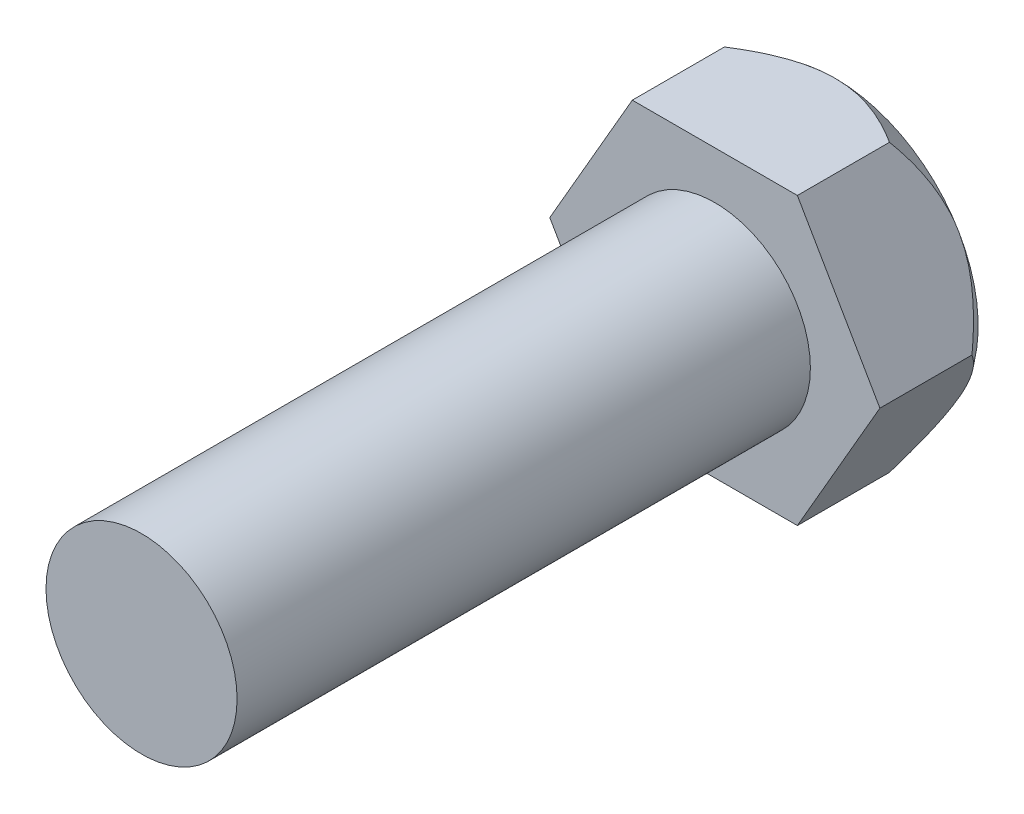
ISO-10303-21;
HEADER;
FILE_DESCRIPTION(('STEP AP214'),'2;1');
FILE_NAME('part.step','',(''),(''),'','','');
FILE_SCHEMA(('AUTOMOTIVE_DESIGN { 1 0 10303 214 1 1 1 1 }'));
ENDSEC;
DATA;
#1=APPLICATION_CONTEXT('core data for automotive mechanical design processes');
#2=APPLICATION_PROTOCOL_DEFINITION('international standard','automotive_design',2000,#1);
#3=PRODUCT_CONTEXT('',#1,'mechanical');
#4=PRODUCT('Part','Part','',(#3));
#5=PRODUCT_RELATED_PRODUCT_CATEGORY('part','',(#4));
#6=PRODUCT_DEFINITION_FORMATION('','',#4);
#7=PRODUCT_DEFINITION_CONTEXT('part definition',#1,'design');
#8=PRODUCT_DEFINITION('design','',#6,#7);
#9=PRODUCT_DEFINITION_SHAPE('','',#8);
#10=(LENGTH_UNIT() NAMED_UNIT(*) SI_UNIT(.MILLI.,.METRE.));
#11=(NAMED_UNIT(*) PLANE_ANGLE_UNIT() SI_UNIT($,.RADIAN.));
#12=(NAMED_UNIT(*) SI_UNIT($,.STERADIAN.) SOLID_ANGLE_UNIT());
#13=UNCERTAINTY_MEASURE_WITH_UNIT(LENGTH_MEASURE(1.E-05),#10,'distance_accuracy_value','');
#14=(GEOMETRIC_REPRESENTATION_CONTEXT(3) GLOBAL_UNCERTAINTY_ASSIGNED_CONTEXT((#13)) GLOBAL_UNIT_ASSIGNED_CONTEXT((#10,
#11,#12)) REPRESENTATION_CONTEXT('',''));
#15=CARTESIAN_POINT('',(0.,0.,0.));
#16=DIRECTION('',(0.,0.,1.));
#17=DIRECTION('',(1.,0.,0.));
#18=AXIS2_PLACEMENT_3D('',#15,#16,#17);
#19=CARTESIAN_POINT('',(5.48482755730155,-9.49999999999993,8.));
#20=DIRECTION('',(-0.866025403784441,0.499999999999995,0.));
#21=DIRECTION('',(-0.499999999999995,-0.866025403784442,0.));
#22=AXIS2_PLACEMENT_3D('',#19,#20,#21);
#23=PLANE('',#22);
#24=CARTESIAN_POINT('',(10.9697705846567,0.000199999999999862,1.88122056340848));
#25=CARTESIAN_POINT('',(10.8935354339522,-0.131843154342836,1.78365785441168));
#26=CARTESIAN_POINT('',(10.816606745852,-0.265087550692122,1.68822601810636));
#27=CARTESIAN_POINT('',(10.6612299080629,-0.534208128062211,1.50229007278218));
#28=CARTESIAN_POINT('',(10.582781090676,-0.670085465570009,1.41178819890072));
#29=CARTESIAN_POINT('',(10.4237842598011,-0.945476054887669,1.2358966425083));
#30=CARTESIAN_POINT('',(10.3432259068873,-1.08500721510855,1.1505440660845));
#31=CARTESIAN_POINT('',(10.1804593258293,-1.3669272032753,0.986485921294663));
#32=CARTESIAN_POINT('',(10.098251296768,-1.50931568639954,0.907779556763656));
#33=CARTESIAN_POINT('',(9.84749676483917,-1.94363527592842,0.681661259586502));
#34=CARTESIAN_POINT('',(9.67621858588584,-2.24029778410347,0.545834776093309));
#35=CARTESIAN_POINT('',(9.41458283133688,-2.69346420405888,0.372275627857531));
#36=CARTESIAN_POINT('',(9.32668397542142,-2.84570948843163,0.319494292936656));
#37=CARTESIAN_POINT('',(9.1494130983004,-3.15275165430755,0.225043414819986));
#38=CARTESIAN_POINT('',(9.06004143318878,-3.3075479190379,0.183371226336434));
#39=CARTESIAN_POINT('',(8.86036330662685,-3.65340057940335,0.104402159122605));
#40=CARTESIAN_POINT('',(8.74975883093453,-3.84497315084696,0.0700625500885323));
#41=CARTESIAN_POINT('',(8.52744089162739,-4.23003911716095,0.0209613729343854));
#42=CARTESIAN_POINT('',(8.41572726041598,-4.42353280231713,0.00620281036134691));
#43=CARTESIAN_POINT('',(8.19288840388419,-4.80950102373074,-0.00300231555809607));
#44=CARTESIAN_POINT('',(8.0817646947536,-5.00197293387044,0.00240640186772825));
#45=CARTESIAN_POINT('',(7.86021016246619,-5.3857166404394,0.0329568256302981));
#46=CARTESIAN_POINT('',(7.74977932207939,-5.57698846671185,0.0580980392911018));
#47=CARTESIAN_POINT('',(7.53097175600113,-5.9559742882399,0.12681013787851));
#48=CARTESIAN_POINT('',(7.42258726614342,-6.14370173142589,0.170283074784708));
#49=CARTESIAN_POINT('',(7.20786067292125,-6.51561910062287,0.273922888742278));
#50=CARTESIAN_POINT('',(7.1015187439428,-6.69980872458842,0.334091184465168));
#51=CARTESIAN_POINT('',(6.78484297986646,-7.24830723749434,0.537447701429925));
#52=CARTESIAN_POINT('',(6.57805171204337,-7.60648021992552,0.703075333685772));
#53=CARTESIAN_POINT('',(6.29899379765979,-8.0898227058921,0.962396805127114));
#54=CARTESIAN_POINT('',(6.22217740709821,-8.22287259719881,1.0377192160485));
#55=CARTESIAN_POINT('',(6.06999139464803,-8.48646650296383,1.19406371213756));
#56=CARTESIAN_POINT('',(5.9946217229499,-8.61701060369478,1.27508560062651));
#57=CARTESIAN_POINT('',(5.84608588643526,-8.8742822192829,1.44121704219265));
#58=CARTESIAN_POINT('',(5.77290477373322,-9.00103562463725,1.5262735866253));
#59=CARTESIAN_POINT('',(5.62785173312317,-9.2522748607662,1.70067193385964));
#60=CARTESIAN_POINT('',(5.55597950701029,-9.37676120804679,1.79001274328518));
#61=CARTESIAN_POINT('',(5.48471208724771,-9.50019999999993,1.88122056340848));
#62=B_SPLINE_CURVE_WITH_KNOTS('',3,(#24,#25,#26,#27,#28,#29,#30,#31,#32,#33,#34,#35,#36,#37,#38,
#39,#40,#41,#42,#43,#44,#45,#46,#47,#48,#49,#50,#51,#52,#53,#54,#55,#56,#57,#58,#59,#60,#61),
.UNSPECIFIED.,.F.,.F.,(4,2,2,2,2,2,2,2,2,2,2,2,2,2,2,2,2,2,4),(0.,0.543048266611905,
1.08634072461626,1.63316917381195,2.17993202397011,3.28307493249778,3.8334344366525,
4.38366277300713,5.0544017416688,5.72524365193724,6.39128093508673,7.0573015893159,
7.71980784690556,8.38237041755489,9.71468864790707,10.2279729814083,10.7412396110703,
11.249014778236,11.7566727734745),.UNSPECIFIED.);
#63=CARTESIAN_POINT('',(10.9696551146029,0.,1.88107276614572));
#64=VERTEX_POINT('',#63);
#65=CARTESIAN_POINT('',(8.22724133595219,-4.74999999999995,0.));
#66=VERTEX_POINT('',#65);
#67=EDGE_CURVE('E122',#64,#66,#62,.T.);
#68=ORIENTED_EDGE('',*,*,#67,.F.);
#69=DIRECTION('',(0.,0.,-1.));
#70=VECTOR('',#69,1.);
#71=CARTESIAN_POINT('',(10.9696551146029,0.,8.));
#72=LINE('',#71,#70);
#73=CARTESIAN_POINT('',(10.9696551146029,0.,8.));
#74=VERTEX_POINT('',#73);
#75=EDGE_CURVE('E126',#74,#64,#72,.T.);
#76=ORIENTED_EDGE('',*,*,#75,.F.);
#77=DIRECTION('',(0.499999999999995,0.866025403784441,0.));
#78=VECTOR('',#77,1.);
#79=CARTESIAN_POINT('',(5.48482755730155,-9.49999999999993,8.));
#80=LINE('',#79,#78);
#81=CARTESIAN_POINT('',(5.48482755730155,-9.49999999999993,8.));
#82=VERTEX_POINT('',#81);
#83=EDGE_CURVE('E221',#82,#74,#80,.T.);
#84=ORIENTED_EDGE('',*,*,#83,.F.);
#85=DIRECTION('',(0.,0.,-1.));
#86=VECTOR('',#85,1.);
#87=CARTESIAN_POINT('',(5.48482755730155,-9.49999999999993,8.));
#88=LINE('',#87,#86);
#89=CARTESIAN_POINT('',(5.48482755730155,-9.49999999999993,1.88107276614572));
#90=VERTEX_POINT('',#89);
#91=EDGE_CURVE('E209',#82,#90,#88,.T.);
#92=ORIENTED_EDGE('',*,*,#91,.T.);
#93=EDGE_CURVE('E177',#66,#90,#62,.T.);
#94=ORIENTED_EDGE('',*,*,#93,.F.);
#95=EDGE_LOOP('',(#68,#76,#84,#92,#94));
#96=FACE_BOUND('',#95,.T.);
#97=ADVANCED_FACE('F32',(#96),#23,.F.);
#98=CARTESIAN_POINT('',(10.9696551146029,0.,8.));
#99=DIRECTION('',(-0.866025403784438,-0.500000000000001,0.));
#100=DIRECTION('',(0.500000000000001,-0.866025403784438,0.));
#101=AXIS2_PLACEMENT_3D('',#98,#99,#100);
#102=PLANE('',#101);
#103=CARTESIAN_POINT('',(5.48471208724758,9.5002,1.88122056340848));
#104=CARTESIAN_POINT('',(5.56094723795206,9.36815684565716,1.78365785441167));
#105=CARTESIAN_POINT('',(5.63787592605233,9.23491244930788,1.68822601810635));
#106=CARTESIAN_POINT('',(5.79325276384142,8.96579187193779,1.50229007278217));
#107=CARTESIAN_POINT('',(5.87170158122832,8.82991453442999,1.41178819890071));
#108=CARTESIAN_POINT('',(6.03069841210316,8.55452394511232,1.23589664250828));
#109=CARTESIAN_POINT('',(6.11125676501703,8.41499278489145,1.15054406608448));
#110=CARTESIAN_POINT('',(6.27402334607504,8.13307279672469,0.986485921294641));
#111=CARTESIAN_POINT('',(6.35623137513633,7.99068431360045,0.907779556763632));
#112=CARTESIAN_POINT('',(6.60698590706516,7.55636472407156,0.681661259586471));
#113=CARTESIAN_POINT('',(6.77826408601849,7.25970221589651,0.545834776093274));
#114=CARTESIAN_POINT('',(7.03989984056745,6.80653579594109,0.37227562785749));
#115=CARTESIAN_POINT('',(7.12779869648291,6.65429051156834,0.319494292936613));
#116=CARTESIAN_POINT('',(7.30506957360394,6.34724834569243,0.225043414819941));
#117=CARTESIAN_POINT('',(7.39444123871556,6.19245208096207,0.183371226336388));
#118=CARTESIAN_POINT('',(7.5941193652775,5.84659942059662,0.104402159122558));
#119=CARTESIAN_POINT('',(7.70472384096982,5.65502684915301,0.0700625500884833));
#120=CARTESIAN_POINT('',(7.92704178027696,5.26996088283903,0.0209613729343354));
#121=CARTESIAN_POINT('',(8.03875541148837,5.07646719768285,0.00620281036129769));
#122=CARTESIAN_POINT('',(8.26159426802016,4.69049897626924,-0.00300231555814454));
#123=CARTESIAN_POINT('',(8.37271797715076,4.49802706612954,0.00240640186767974));
#124=CARTESIAN_POINT('',(8.59427250943817,4.11428335956059,0.0329568256302478));
#125=CARTESIAN_POINT('',(8.70470334982496,3.92301153328813,0.0580980392910498));
#126=CARTESIAN_POINT('',(8.92351091590323,3.54402571176009,0.126810137878457));
#127=CARTESIAN_POINT('',(9.03189540576094,3.3562982685741,0.170283074784657));
#128=CARTESIAN_POINT('',(9.24662199898311,2.98438089937712,0.273922888742226));
#129=CARTESIAN_POINT('',(9.35296392796156,2.80019127541157,0.334091184465116));
#130=CARTESIAN_POINT('',(9.6696396920379,2.25169276250566,0.537447701429871));
#131=CARTESIAN_POINT('',(9.876430959861,1.89351978007447,0.703075333685717));
#132=CARTESIAN_POINT('',(10.1554888742446,1.4101772941079,0.962396805127061));
#133=CARTESIAN_POINT('',(10.2323052648062,1.27712740280117,1.03771921604845));
#134=CARTESIAN_POINT('',(10.3844912772564,1.01353349703614,1.19406371213752));
#135=CARTESIAN_POINT('',(10.4598609489545,0.882989396305185,1.27508560062648));
#136=CARTESIAN_POINT('',(10.6083967854691,0.625717780717059,1.44121704219262));
#137=CARTESIAN_POINT('',(10.6815778981712,0.498964375362699,1.52627358662528));
#138=CARTESIAN_POINT('',(10.8266309387812,0.247725139233735,1.70067193385963));
#139=CARTESIAN_POINT('',(10.8985031648941,0.123238791953139,1.79001274328518));
#140=CARTESIAN_POINT('',(10.9697705846567,-0.000200000000000309,1.88122056340848));
#141=B_SPLINE_CURVE_WITH_KNOTS('',3,(#103,#104,#105,#106,#107,#108,#109,#110,#111,#112,#113,
#114,#115,#116,#117,#118,#119,#120,#121,#122,#123,#124,#125,#126,#127,#128,#129,#130,#131,#132,
#133,#134,#135,#136,#137,#138,#139,#140),.UNSPECIFIED.,.F.,.F.,(4,2,2,2,2,2,2,2,2,2,2,2,2,2,2,2,
2,2,4),(0.,0.543048266611915,1.08634072461628,1.63316917381198,2.17993202397015,
3.28307493249783,3.83343443665256,4.3836627730072,5.05440174166887,5.72524365193731,
6.3912809350868,7.05730158931596,7.71980784690562,8.38237041755495,9.71468864790712,
10.2279729814084,10.7412396110705,11.2490147782361,11.7566727734747),.UNSPECIFIED.);
#142=CARTESIAN_POINT('',(5.48482755730142,9.5,1.88107276614572));
#143=VERTEX_POINT('',#142);
#144=CARTESIAN_POINT('',(8.22724133595215,4.75000000000001,0.));
#145=VERTEX_POINT('',#144);
#146=EDGE_CURVE('E103',#143,#145,#141,.T.);
#147=ORIENTED_EDGE('',*,*,#146,.F.);
#148=DIRECTION('',(0.,0.,-1.));
#149=VECTOR('',#148,1.);
#150=CARTESIAN_POINT('',(5.48482755730142,9.5,8.));
#151=LINE('',#150,#149);
#152=CARTESIAN_POINT('',(5.48482755730142,9.5,8.));
#153=VERTEX_POINT('',#152);
#154=EDGE_CURVE('E206',#153,#143,#151,.T.);
#155=ORIENTED_EDGE('',*,*,#154,.F.);
#156=DIRECTION('',(-0.500000000000001,0.866025403784438,0.));
#157=VECTOR('',#156,1.);
#158=CARTESIAN_POINT('',(10.9696551146029,0.,8.));
#159=LINE('',#158,#157);
#160=EDGE_CURVE('E218',#74,#153,#159,.T.);
#161=ORIENTED_EDGE('',*,*,#160,.F.);
#162=ORIENTED_EDGE('',*,*,#75,.T.);
#163=EDGE_CURVE('E115',#145,#64,#141,.T.);
#164=ORIENTED_EDGE('',*,*,#163,.F.);
#165=EDGE_LOOP('',(#147,#155,#161,#162,#164));
#166=FACE_BOUND('',#165,.T.);
#167=ADVANCED_FACE('F131',(#166),#102,.F.);
#168=CARTESIAN_POINT('',(5.48482755730142,9.5,8.));
#169=DIRECTION('',(0.,-1.,0.));
#170=DIRECTION('',(1.,0.,0.));
#171=AXIS2_PLACEMENT_3D('',#168,#169,#170);
#172=PLANE('',#171);
#173=CARTESIAN_POINT('',(-11.1730063148762,9.49999999999994,6.61193908622565));
#174=CARTESIAN_POINT('',(-10.9210228263725,9.49999999999994,6.36628117361341));
#175=CARTESIAN_POINT('',(-10.6673352499112,9.49999999999994,6.12234504515453));
#176=CARTESIAN_POINT('',(-10.1558458750238,9.49999999999995,5.63870149425191));
#177=CARTESIAN_POINT('',(-9.89804307460484,9.49999999999995,5.39899513255183));
#178=CARTESIAN_POINT('',(-9.37544105634884,9.49999999999995,4.92262191610688));
#179=CARTESIAN_POINT('',(-9.11060013242283,9.49999999999995,4.68600067428334));
#180=CARTESIAN_POINT('',(-8.57532573823089,9.49999999999995,4.21919736473347));
#181=CARTESIAN_POINT('',(-8.30489272212796,9.49999999999995,3.98901477763493));
#182=CARTESIAN_POINT('',(-7.73922593939858,9.49999999999996,3.52158290010933));
#183=CARTESIAN_POINT('',(-7.44353827109927,9.49999999999996,3.28488038720294));
#184=CARTESIAN_POINT('',(-6.84312021189026,9.49999999999996,2.8230179501509));
#185=CARTESIAN_POINT('',(-6.5383878700482,9.49999999999996,2.59786054527033));
#186=CARTESIAN_POINT('',(-5.91938593754483,9.49999999999996,2.16345831894875));
#187=CARTESIAN_POINT('',(-5.6051552876495,9.49999999999996,1.95415833132407));
#188=CARTESIAN_POINT('',(-4.96435446808387,9.49999999999996,1.55544081216342));
#189=CARTESIAN_POINT('',(-4.63779157079238,9.49999999999996,1.36601180413869));
#190=CARTESIAN_POINT('',(-4.18283699307235,9.49999999999997,1.125703876405));
#191=CARTESIAN_POINT('',(-4.06048205926938,9.49999999999997,1.06332106829326));
#192=CARTESIAN_POINT('',(-3.81386904901428,9.49999999999997,0.942469332665061));
#193=CARTESIAN_POINT('',(-3.68961125917642,9.49999999999997,0.883999822703412));
#194=CARTESIAN_POINT('',(-3.43912547154442,9.49999999999997,0.771375889658834));
#195=CARTESIAN_POINT('',(-3.31289717823721,9.49999999999997,0.717222121381308));
#196=CARTESIAN_POINT('',(-3.05844394687724,9.49999999999997,0.613674079406628));
#197=CARTESIAN_POINT('',(-2.93021814685785,9.49999999999997,0.564281930469366));
#198=CARTESIAN_POINT('',(-2.54578064776804,9.49999999999997,0.425127556355024));
#199=CARTESIAN_POINT('',(-2.28673679440347,9.49999999999997,0.342985163816335));
#200=CARTESIAN_POINT('',(-1.76220499574268,9.49999999999998,0.203075554443009));
#201=CARTESIAN_POINT('',(-1.49672069243637,9.49999999999998,0.145294886181791));
#202=CARTESIAN_POINT('',(-1.0122956378565,9.49999999999998,0.0657414901185175));
#203=CARTESIAN_POINT('',(-0.794137673399279,9.49999999999998,0.0392023304317399));
#204=CARTESIAN_POINT('',(-0.35634252444937,9.49999999999998,0.00533942434174013));
#205=CARTESIAN_POINT('',(-0.136705575254256,9.49999999999998,-0.00198730946303514));
#206=CARTESIAN_POINT('',(0.302412254253951,9.49999999999998,0.00291217328707614));
#207=CARTESIAN_POINT('',(0.521893069818236,9.49999999999998,0.0151441308128));
#208=CARTESIAN_POINT('',(0.95896798526285,9.49999999999999,0.0586084360796174));
#209=CARTESIAN_POINT('',(1.17656176790071,9.49999999999999,0.0898439181546996));
#210=CARTESIAN_POINT('',(1.66279350394372,9.49999999999999,0.18010868434694));
#211=CARTESIAN_POINT('',(1.93050120960263,9.49999999999999,0.244153338093577));
#212=CARTESIAN_POINT('',(2.45893803596592,9.49999999999999,0.396381196955861));
#213=CARTESIAN_POINT('',(2.7196644205673,9.49999999999999,0.48457371833034));
#214=CARTESIAN_POINT('',(3.23632433781626,9.49999999999999,0.682284659665005));
#215=CARTESIAN_POINT('',(3.49216573356518,9.5,0.792041173018873));
#216=CARTESIAN_POINT('',(3.99577298094444,9.5,1.02838499194663));
#217=CARTESIAN_POINT('',(4.24354100955711,9.5,1.15496771278155));
#218=CARTESIAN_POINT('',(4.84574200564072,9.5,1.48416388803969));
#219=CARTESIAN_POINT('',(5.19585783689948,9.5,1.69464551445997));
#220=CARTESIAN_POINT('',(5.88228519422141,9.5,2.1371859711377));
#221=CARTESIAN_POINT('',(6.21858701490324,9.5,2.369259609897));
#222=CARTESIAN_POINT('',(6.88077427753948,9.50000000000001,2.85031966933935));
#223=CARTESIAN_POINT('',(7.20661441409193,9.50000000000001,3.09936801711059));
#224=CARTESIAN_POINT('',(7.84846491962676,9.50000000000001,3.60958046128016));
#225=CARTESIAN_POINT('',(8.16447779228946,9.50000000000001,3.87074142881035));
#226=CARTESIAN_POINT('',(8.767809909373,9.50000000000001,4.38487259464393));
#227=CARTESIAN_POINT('',(9.05564415780398,9.50000000000002,4.6372412892941));
#228=CARTESIAN_POINT('',(9.62543925373412,9.50000000000002,5.14855743524692));
#229=CARTESIAN_POINT('',(9.90739957598004,9.50000000000002,5.40750547032527));
#230=CARTESIAN_POINT('',(10.4637854600754,9.50000000000002,5.92831105369764));
#231=CARTESIAN_POINT('',(10.7382563517965,9.50000000000002,6.19012032193928));
#232=CARTESIAN_POINT('',(11.2829411767202,9.50000000000002,6.71800116047695));
#233=CARTESIAN_POINT('',(11.5531561430503,9.50000000000002,6.98407166371227));
#234=CARTESIAN_POINT('',(11.8216259649823,9.50000000000002,7.25186590520364));
#235=B_SPLINE_CURVE_WITH_KNOTS('',3,(#173,#174,#175,#176,#177,#178,#179,#180,#181,#182,#183,
#184,#185,#186,#187,#188,#189,#190,#191,#192,#193,#194,#195,#196,#197,#198,#199,#200,#201,#202,
#203,#204,#205,#206,#207,#208,#209,#210,#211,#212,#213,#214,#215,#216,#217,#218,#219,#220,#221,
#222,#223,#224,#225,#226,#227,#228,#229,#230,#231,#232,#233,#234),.UNSPECIFIED.,.F.,.F.,(4,2,2,
2,2,2,2,2,2,2,2,2,2,2,2,2,2,2,2,2,2,2,2,2,2,2,2,2,2,2,4),(0.,1.05576093672828,2.11178297920377,
3.1771419516466,4.24241473793455,5.37847332271195,6.51477876166543,7.64692992303992,
8.77842356784806,9.19039012215261,9.60229522343458,10.014262702456,10.426413169473,
11.2406109755445,12.0543586283212,12.712866470534,13.3712719131827,14.0298706499688,
14.6885780417694,15.5130017601458,16.3377439908345,17.1721636715565,18.0063564571504,
19.2307461110066,20.4559817695083,21.6859550672279,22.9156123952833,24.0639032196643,
25.2122962885648,26.3501848300457,27.487792753706),.UNSPECIFIED.);
#236=CARTESIAN_POINT('',(-5.48482755730148,9.49999999999996,1.88107276614572));
#237=VERTEX_POINT('',#236);
#238=CARTESIAN_POINT('',(0.,9.49999999999999,0.));
#239=VERTEX_POINT('',#238);
#240=EDGE_CURVE('E48',#237,#239,#235,.T.);
#241=ORIENTED_EDGE('',*,*,#240,.F.);
#242=DIRECTION('',(0.,0.,-1.));
#243=VECTOR('',#242,1.);
#244=CARTESIAN_POINT('',(-5.48482755730148,9.49999999999996,8.));
#245=LINE('',#244,#243);
#246=CARTESIAN_POINT('',(-5.48482755730148,9.49999999999996,8.));
#247=VERTEX_POINT('',#246);
#248=EDGE_CURVE('E203',#247,#237,#245,.T.);
#249=ORIENTED_EDGE('',*,*,#248,.F.);
#250=DIRECTION('',(-1.,0.,0.));
#251=VECTOR('',#250,1.);
#252=CARTESIAN_POINT('',(5.48482755730142,9.5,8.));
#253=LINE('',#252,#251);
#254=EDGE_CURVE('E217',#153,#247,#253,.T.);
#255=ORIENTED_EDGE('',*,*,#254,.F.);
#256=ORIENTED_EDGE('',*,*,#154,.T.);
#257=EDGE_CURVE('E109',#239,#143,#235,.T.);
#258=ORIENTED_EDGE('',*,*,#257,.F.);
#259=EDGE_LOOP('',(#241,#249,#255,#256,#258));
#260=FACE_BOUND('',#259,.T.);
#261=ADVANCED_FACE('F215',(#260),#172,.F.);
#262=CARTESIAN_POINT('',(-5.48482755730148,9.49999999999996,8.));
#263=DIRECTION('',(0.866025403784441,-0.499999999999995,0.));
#264=DIRECTION('',(0.499999999999995,0.866025403784442,0.));
#265=AXIS2_PLACEMENT_3D('',#262,#263,#264);
#266=PLANE('',#265);
#267=CARTESIAN_POINT('',(-10.9697705846567,-0.000200000000076601,1.88122056340848));
#268=CARTESIAN_POINT('',(-10.8935354339522,0.131843154342762,1.78365785441167));
#269=CARTESIAN_POINT('',(-10.816606745852,0.265087550692049,1.68822601810635));
#270=CARTESIAN_POINT('',(-10.6612299080629,0.534208128062143,1.50229007278217));
#271=CARTESIAN_POINT('',(-10.582781090676,0.670085465569943,1.41178819890071));
#272=CARTESIAN_POINT('',(-10.4237842598011,0.945476054887606,1.23589664250828));
#273=CARTESIAN_POINT('',(-10.3432259068873,1.08500721510848,1.15054406608448));
#274=CARTESIAN_POINT('',(-10.1804593258293,1.36692720327525,0.98648592129464));
#275=CARTESIAN_POINT('',(-10.098251296768,1.50931568639949,0.907779556763632));
#276=CARTESIAN_POINT('',(-9.84749676483915,1.94363527592838,0.681661259586472));
#277=CARTESIAN_POINT('',(-9.67621858588582,2.24029778410342,0.545834776093272));
#278=CARTESIAN_POINT('',(-9.41458283133686,2.69346420405885,0.372275627857489));
#279=CARTESIAN_POINT('',(-9.3266839754214,2.8457094884316,0.319494292936613));
#280=CARTESIAN_POINT('',(-9.14941309830037,3.15275165430752,0.225043414819941));
#281=CARTESIAN_POINT('',(-9.06004143318876,3.30754791903787,0.183371226336387));
#282=CARTESIAN_POINT('',(-8.86036330662682,3.65340057940332,0.104402159122556));
#283=CARTESIAN_POINT('',(-8.7497588309345,3.84497315084694,0.0700625500884826));
#284=CARTESIAN_POINT('',(-8.52744089162736,4.23003911716092,0.0209613729343351));
#285=CARTESIAN_POINT('',(-8.41572726041595,4.4235328023171,0.00620281036129708));
#286=CARTESIAN_POINT('',(-8.19288840388417,4.80950102373071,-0.00300231555814504));
#287=CARTESIAN_POINT('',(-8.08176469475357,5.00197293387041,0.00240640186767966));
#288=CARTESIAN_POINT('',(-7.86021016246616,5.38571664043937,0.0329568256302479));
#289=CARTESIAN_POINT('',(-7.74977932207937,5.57698846671182,0.0580980392910496));
#290=CARTESIAN_POINT('',(-7.5309717560011,5.95597428823987,0.126810137878457));
#291=CARTESIAN_POINT('',(-7.42258726614339,6.14370173142586,0.170283074784657));
#292=CARTESIAN_POINT('',(-7.20786067292122,6.51561910062284,0.273922888742227));
#293=CARTESIAN_POINT('',(-7.10151874394278,6.69980872458838,0.334091184465117));
#294=CARTESIAN_POINT('',(-6.78484297986644,7.2483072374943,0.537447701429872));
#295=CARTESIAN_POINT('',(-6.57805171204335,7.60648021992549,0.703075333685719));
#296=CARTESIAN_POINT('',(-6.29899379765976,8.08982270589207,0.962396805127062));
#297=CARTESIAN_POINT('',(-6.22217740709818,8.22287259719879,1.03771921604845));
#298=CARTESIAN_POINT('',(-6.06999139464799,8.48646650296383,1.19406371213752));
#299=CARTESIAN_POINT('',(-5.99462172294986,8.61701060369478,1.27508560062648));
#300=CARTESIAN_POINT('',(-5.84608588643521,8.8742822192829,1.44121704219262));
#301=CARTESIAN_POINT('',(-5.77290477373317,9.00103562463726,1.52627358662528));
#302=CARTESIAN_POINT('',(-5.62785173312311,9.25227486076623,1.70067193385963));
#303=CARTESIAN_POINT('',(-5.55597950701023,9.37676120804682,1.79001274328518));
#304=CARTESIAN_POINT('',(-5.48471208724764,9.50019999999996,1.88122056340848));
#305=B_SPLINE_CURVE_WITH_KNOTS('',3,(#267,#268,#269,#270,#271,#272,#273,#274,#275,#276,#277,
#278,#279,#280,#281,#282,#283,#284,#285,#286,#287,#288,#289,#290,#291,#292,#293,#294,#295,#296,
#297,#298,#299,#300,#301,#302,#303,#304),.UNSPECIFIED.,.F.,.F.,(4,2,2,2,2,2,2,2,2,2,2,2,2,2,2,2,
2,2,4),(0.,0.543048266611914,1.08634072461628,1.63316917381198,2.17993202397015,
3.28307493249783,3.83343443665257,4.38366277300721,5.05440174166887,5.72524365193731,
6.3912809350868,7.05730158931597,7.71980784690563,8.38237041755495,9.71468864790713,
10.2279729814084,10.7412396110704,11.2490147782361,11.7566727734747),.UNSPECIFIED.);
#306=CARTESIAN_POINT('',(-10.9696551146029,0.,1.88107276614572));
#307=VERTEX_POINT('',#306);
#308=CARTESIAN_POINT('',(-8.22724133595218,4.74999999999995,0.));
#309=VERTEX_POINT('',#308);
#310=EDGE_CURVE('E55',#307,#309,#305,.T.);
#311=ORIENTED_EDGE('',*,*,#310,.F.);
#312=DIRECTION('',(0.,0.,-1.));
#313=VECTOR('',#312,1.);
#314=CARTESIAN_POINT('',(-10.9696551146029,0.,8.));
#315=LINE('',#314,#313);
#316=CARTESIAN_POINT('',(-10.9696551146029,0.,8.));
#317=VERTEX_POINT('',#316);
#318=EDGE_CURVE('E197',#317,#307,#315,.T.);
#319=ORIENTED_EDGE('',*,*,#318,.F.);
#320=DIRECTION('',(-0.499999999999995,-0.866025403784441,0.));
#321=VECTOR('',#320,1.);
#322=CARTESIAN_POINT('',(-5.48482755730148,9.49999999999996,8.));
#323=LINE('',#322,#321);
#324=EDGE_CURVE('E236',#247,#317,#323,.T.);
#325=ORIENTED_EDGE('',*,*,#324,.F.);
#326=ORIENTED_EDGE('',*,*,#248,.T.);
#327=EDGE_CURVE('E114',#309,#237,#305,.T.);
#328=ORIENTED_EDGE('',*,*,#327,.F.);
#329=EDGE_LOOP('',(#311,#319,#325,#326,#328));
#330=FACE_BOUND('',#329,.T.);
#331=ADVANCED_FACE('F195',(#330),#266,.F.);
#332=CARTESIAN_POINT('',(-10.9696551146029,0.,8.));
#333=DIRECTION('',(0.866025403784435,0.500000000000007,0.));
#334=DIRECTION('',(-0.500000000000007,0.866025403784435,0.));
#335=AXIS2_PLACEMENT_3D('',#332,#333,#334);
#336=PLANE('',#335);
#337=CARTESIAN_POINT('',(-5.48471208724751,-9.50020000000004,1.88122056340848));
#338=CARTESIAN_POINT('',(-5.560947237952,-9.36815684565721,1.78365785441167));
#339=CARTESIAN_POINT('',(-5.63787592605227,-9.23491244930792,1.68822601810635));
#340=CARTESIAN_POINT('',(-5.79325276384136,-8.96579187193783,1.50229007278217));
#341=CARTESIAN_POINT('',(-5.87170158122826,-8.82991453443003,1.41178819890071));
#342=CARTESIAN_POINT('',(-6.0306984121031,-8.55452394511237,1.23589664250828));
#343=CARTESIAN_POINT('',(-6.11125676501697,-8.41499278489149,1.15054406608448));
#344=CARTESIAN_POINT('',(-6.27402334607499,-8.13307279672473,0.98648592129464));
#345=CARTESIAN_POINT('',(-6.35623137513627,-7.99068431360049,0.907779556763631));
#346=CARTESIAN_POINT('',(-6.6069859070651,-7.55636472407161,0.681661259586471));
#347=CARTESIAN_POINT('',(-6.77826408601844,-7.25970221589656,0.545834776093275));
#348=CARTESIAN_POINT('',(-7.0398998405674,-6.80653579594114,0.37227562785749));
#349=CARTESIAN_POINT('',(-7.12779869648286,-6.65429051156839,0.319494292936613));
#350=CARTESIAN_POINT('',(-7.30506957360389,-6.34724834569248,0.225043414819941));
#351=CARTESIAN_POINT('',(-7.39444123871551,-6.19245208096212,0.183371226336388));
#352=CARTESIAN_POINT('',(-7.59411936527746,-5.84659942059667,0.104402159122558));
#353=CARTESIAN_POINT('',(-7.70472384096978,-5.65502684915306,0.0700625500884843));
#354=CARTESIAN_POINT('',(-7.92704178027692,-5.26996088283908,0.0209613729343356));
#355=CARTESIAN_POINT('',(-8.03875541148834,-5.0764671976829,0.00620281036129666));
#356=CARTESIAN_POINT('',(-8.26159426802013,-4.6904989762693,-0.00300231555814572));
#357=CARTESIAN_POINT('',(-8.37271797715073,-4.4980270661296,0.0024064018676796));
#358=CARTESIAN_POINT('',(-8.59427250943814,-4.11428335956064,0.032956825630248));
#359=CARTESIAN_POINT('',(-8.70470334982494,-3.92301153328819,0.0580980392910492));
#360=CARTESIAN_POINT('',(-8.92351091590321,-3.54402571176015,0.126810137878456));
#361=CARTESIAN_POINT('',(-9.03189540576092,-3.35629826857416,0.170283074784657));
#362=CARTESIAN_POINT('',(-9.2466219989831,-2.98438089937718,0.273922888742227));
#363=CARTESIAN_POINT('',(-9.35296392796154,-2.80019127541164,0.334091184465117));
#364=CARTESIAN_POINT('',(-9.66963969203789,-2.25169276250572,0.537447701429872));
#365=CARTESIAN_POINT('',(-9.87643095986099,-1.89351978007454,0.70307533368572));
#366=CARTESIAN_POINT('',(-10.1554888742446,-1.41017729410796,0.962396805127063));
#367=CARTESIAN_POINT('',(-10.2323052648062,-1.27712740280124,1.03771921604845));
#368=CARTESIAN_POINT('',(-10.3844912772564,-1.01353349703621,1.19406371213752));
#369=CARTESIAN_POINT('',(-10.4598609489545,-0.882989396305257,1.27508560062648));
#370=CARTESIAN_POINT('',(-10.6083967854691,-0.625717780717132,1.44121704219262));
#371=CARTESIAN_POINT('',(-10.6815778981712,-0.498964375362772,1.52627358662528));
#372=CARTESIAN_POINT('',(-10.8266309387812,-0.247725139233809,1.70067193385963));
#373=CARTESIAN_POINT('',(-10.8985031648941,-0.123238791953215,1.79001274328518));
#374=CARTESIAN_POINT('',(-10.9697705846567,0.000199999999923735,1.88122056340848));
#375=B_SPLINE_CURVE_WITH_KNOTS('',3,(#337,#338,#339,#340,#341,#342,#343,#344,#345,#346,#347,
#348,#349,#350,#351,#352,#353,#354,#355,#356,#357,#358,#359,#360,#361,#362,#363,#364,#365,#366,
#367,#368,#369,#370,#371,#372,#373,#374),.UNSPECIFIED.,.F.,.F.,(4,2,2,2,2,2,2,2,2,2,2,2,2,2,2,2,
2,2,4),(0.,0.543048266611912,1.08634072461628,1.63316917381198,2.17993202397014,
3.28307493249783,3.83343443665256,4.3836627730072,5.05440174166887,5.72524365193731,
6.3912809350868,7.05730158931597,7.71980784690563,8.38237041755495,9.71468864790713,
10.2279729814084,10.7412396110705,11.2490147782361,11.7566727734747),.UNSPECIFIED.);
#376=CARTESIAN_POINT('',(-5.48482755730135,-9.50000000000004,1.88107276614572));
#377=VERTEX_POINT('',#376);
#378=CARTESIAN_POINT('',(-8.22724133595212,-4.75000000000006,0.));
#379=VERTEX_POINT('',#378);
#380=EDGE_CURVE('E171',#377,#379,#375,.T.);
#381=ORIENTED_EDGE('',*,*,#380,.F.);
#382=DIRECTION('',(0.,0.,-1.));
#383=VECTOR('',#382,1.);
#384=CARTESIAN_POINT('',(-5.48482755730135,-9.50000000000004,8.));
#385=LINE('',#384,#383);
#386=CARTESIAN_POINT('',(-5.48482755730135,-9.50000000000004,8.));
#387=VERTEX_POINT('',#386);
#388=EDGE_CURVE('E204',#387,#377,#385,.T.);
#389=ORIENTED_EDGE('',*,*,#388,.F.);
#390=DIRECTION('',(0.500000000000007,-0.866025403784435,0.));
#391=VECTOR('',#390,1.);
#392=CARTESIAN_POINT('',(-10.9696551146029,0.,8.));
#393=LINE('',#392,#391);
#394=EDGE_CURVE('E202',#317,#387,#393,.T.);
#395=ORIENTED_EDGE('',*,*,#394,.F.);
#396=ORIENTED_EDGE('',*,*,#318,.T.);
#397=EDGE_CURVE('E133',#379,#307,#375,.T.);
#398=ORIENTED_EDGE('',*,*,#397,.F.);
#399=EDGE_LOOP('',(#381,#389,#395,#396,#398));
#400=FACE_BOUND('',#399,.T.);
#401=ADVANCED_FACE('F200',(#400),#336,.F.);
#402=CARTESIAN_POINT('',(-5.48482755730135,-9.50000000000004,8.));
#403=DIRECTION('',(0.,1.,0.));
#404=DIRECTION('',(-1.,0.,0.));
#405=AXIS2_PLACEMENT_3D('',#402,#403,#404);
#406=PLANE('',#405);
#407=CARTESIAN_POINT('',(-11.1730063153233,-9.5000000000001,6.61193908666174));
#408=CARTESIAN_POINT('',(-10.9210228268075,-9.5000000000001,6.36628117403364));
#409=CARTESIAN_POINT('',(-10.6673352503341,-9.5000000000001,6.12234504555892));
#410=CARTESIAN_POINT('',(-10.1558458754225,-9.50000000000009,5.63870149462466));
#411=CARTESIAN_POINT('',(-9.89804307499133,-9.50000000000009,5.39899513290879));
#412=CARTESIAN_POINT('',(-9.37544105671048,-9.50000000000008,4.92262191643208));
#413=CARTESIAN_POINT('',(-9.11060013277184,-9.50000000000008,4.68600067459258));
#414=CARTESIAN_POINT('',(-8.57532573855437,-9.50000000000007,4.21919736501093));
#415=CARTESIAN_POINT('',(-8.30489272243855,-9.50000000000007,3.98901477789658));
#416=CARTESIAN_POINT('',(-7.73922593967954,-9.50000000000006,3.52158290033638));
#417=CARTESIAN_POINT('',(-7.44353827136338,-9.50000000000006,3.28488038741131));
#418=CARTESIAN_POINT('',(-6.84312021211995,-9.50000000000005,2.82301795032259));
#419=CARTESIAN_POINT('',(-6.5383878702603,-9.50000000000005,2.59786054542401));
#420=CARTESIAN_POINT('',(-5.91938593772088,-9.50000000000004,2.16345831906767));
#421=CARTESIAN_POINT('',(-5.6051552878071,-9.50000000000004,1.95415833142621));
#422=CARTESIAN_POINT('',(-4.96435446820322,-9.50000000000003,1.55544081223377));
#423=CARTESIAN_POINT('',(-4.63779157089194,-9.50000000000003,1.36601180419403));
#424=CARTESIAN_POINT('',(-4.18283699314542,-9.50000000000003,1.12570387644269));
#425=CARTESIAN_POINT('',(-4.06048205933652,-9.50000000000003,1.06332106832703));
#426=CARTESIAN_POINT('',(-3.81386904906938,-9.50000000000002,0.942469332691325));
#427=CARTESIAN_POINT('',(-3.6896112592254,-9.50000000000002,0.883999822726092));
#428=CARTESIAN_POINT('',(-3.43912547158097,-9.50000000000002,0.771375889674736));
#429=CARTESIAN_POINT('',(-3.31289717826745,-9.50000000000002,0.717222121394017));
#430=CARTESIAN_POINT('',(-3.05844394689463,-9.50000000000001,0.613674079413409));
#431=CARTESIAN_POINT('',(-2.93021814686872,-9.50000000000001,0.564281930473415));
#432=CARTESIAN_POINT('',(-2.54578064775964,-9.50000000000001,0.425127556351901));
#433=CARTESIAN_POINT('',(-2.28673679438206,-9.50000000000001,0.342985163809511));
#434=CARTESIAN_POINT('',(-1.76220499569466,-9.5,0.203075554431379));
#435=CARTESIAN_POINT('',(-1.49672069237475,-9.5,0.145294886169053));
#436=CARTESIAN_POINT('',(-1.01229563778205,-9.49999999999999,0.0657414901084538));
#437=CARTESIAN_POINT('',(-0.794137673325787,-9.49999999999999,0.0392023304239431));
#438=CARTESIAN_POINT('',(-0.356342524377987,-9.49999999999999,0.00533942433834844));
#439=CARTESIAN_POINT('',(-0.136705575184026,-9.49999999999998,-0.00198730946428885));
#440=CARTESIAN_POINT('',(0.302412254321774,-9.49999999999998,0.00291217328986808));
#441=CARTESIAN_POINT('',(0.521893069884806,-9.49999999999998,0.0151441308175068));
#442=CARTESIAN_POINT('',(0.958967985326777,-9.49999999999997,0.0586084360878609));
#443=CARTESIAN_POINT('',(1.17656176796325,-9.49999999999997,0.0898439181645649));
#444=CARTESIAN_POINT('',(1.66279350400696,-9.49999999999996,0.180108684360807));
#445=CARTESIAN_POINT('',(1.93050120966788,-9.49999999999996,0.244153338110131));
#446=CARTESIAN_POINT('',(2.45893803603494,-9.49999999999996,0.396381196977912));
#447=CARTESIAN_POINT('',(2.71966442063808,-9.49999999999995,0.484573718355202));
#448=CARTESIAN_POINT('',(3.2363243378904,-9.49999999999995,0.682284659695526));
#449=CARTESIAN_POINT('',(3.4921657336409,-9.49999999999994,0.79204117305224));
#450=CARTESIAN_POINT('',(3.9957729810232,-9.49999999999994,1.02838499198564));
#451=CARTESIAN_POINT('',(4.24354100963734,-9.49999999999994,1.15496771282336));
#452=CARTESIAN_POINT('',(4.84574200573055,-9.49999999999993,1.48416388809163));
#453=CARTESIAN_POINT('',(5.19585783699712,-9.49999999999993,1.6946455145197));
#454=CARTESIAN_POINT('',(5.8822851943342,-9.49999999999992,2.13718597121346));
#455=CARTESIAN_POINT('',(6.21858701502336,-9.49999999999992,2.36925960998101));
#456=CARTESIAN_POINT('',(6.88077427767398,-9.49999999999991,2.85031966944013));
#457=CARTESIAN_POINT('',(7.20661441423345,-9.49999999999991,3.0993680172199));
#458=CARTESIAN_POINT('',(7.84846491978213,-9.4999999999999,3.60958046140665));
#459=CARTESIAN_POINT('',(8.16447779245164,-9.4999999999999,3.87074142894548));
#460=CARTESIAN_POINT('',(8.76780990954778,-9.49999999999989,4.3848725947955));
#461=CARTESIAN_POINT('',(9.05564415798457,-9.49999999999989,4.63724128945343));
#462=CARTESIAN_POINT('',(9.62543925392625,-9.49999999999988,5.14855743542181));
#463=CARTESIAN_POINT('',(9.90739957617791,-9.49999999999988,5.40750547050793));
#464=CARTESIAN_POINT('',(10.4637854602847,-9.49999999999987,5.92831105389578));
#465=CARTESIAN_POINT('',(10.7382563520114,-9.49999999999987,6.19012032214513));
#466=CARTESIAN_POINT('',(11.2829411769463,-9.49999999999986,6.71800116069819));
#467=CARTESIAN_POINT('',(11.553156143282,-9.49999999999986,6.98407166394121));
#468=CARTESIAN_POINT('',(11.8216259652196,-9.49999999999986,7.25186590544026));
#469=B_SPLINE_CURVE_WITH_KNOTS('',3,(#407,#408,#409,#410,#411,#412,#413,#414,#415,#416,#417,
#418,#419,#420,#421,#422,#423,#424,#425,#426,#427,#428,#429,#430,#431,#432,#433,#434,#435,#436,
#437,#438,#439,#440,#441,#442,#443,#444,#445,#446,#447,#448,#449,#450,#451,#452,#453,#454,#455,
#456,#457,#458,#459,#460,#461,#462,#463,#464,#465,#466,#467,#468),.UNSPECIFIED.,.F.,.F.,(4,2,2,
2,2,2,2,2,2,2,2,2,2,2,2,2,2,2,2,2,2,2,2,2,2,2,2,2,2,2,4),(0.,1.05576093678734,2.11178297932191,
3.17714195182493,4.24241473817306,5.37847332302491,6.51477876205289,7.6469299235013,
8.77842356838325,9.19039012270897,9.60229522401211,10.0142627030547,10.4264131700929,
11.2406109762048,12.0543586290219,12.712866471231,13.371271913876,14.0298706506588,
14.6885780424559,15.51300176084,16.3377439915364,17.1721636722662,18.0063564578678,
19.2307461117561,20.4559817702899,21.6859550680419,22.9156123961295,24.063903220539,
25.2122962894679,26.350184830977,27.4877927546655),.UNSPECIFIED.);
#470=CARTESIAN_POINT('',(0.,-9.49999999999998,0.));
#471=VERTEX_POINT('',#470);
#472=EDGE_CURVE('E184',#90,#471,#469,.F.);
#473=ORIENTED_EDGE('',*,*,#472,.F.);
#474=ORIENTED_EDGE('',*,*,#91,.F.);
#475=DIRECTION('',(1.,0.,0.));
#476=VECTOR('',#475,1.);
#477=CARTESIAN_POINT('',(-5.48482755730135,-9.50000000000004,8.));
#478=LINE('',#477,#476);
#479=EDGE_CURVE('E226',#387,#82,#478,.T.);
#480=ORIENTED_EDGE('',*,*,#479,.F.);
#481=ORIENTED_EDGE('',*,*,#388,.T.);
#482=EDGE_CURVE('E162',#471,#377,#469,.F.);
#483=ORIENTED_EDGE('',*,*,#482,.F.);
#484=EDGE_LOOP('',(#473,#474,#480,#481,#483));
#485=FACE_BOUND('',#484,.T.);
#486=ADVANCED_FACE('F251',(#485),#406,.F.);
#487=CARTESIAN_POINT('',(0.,0.,8.));
#488=DIRECTION('',(0.,0.,1.));
#489=DIRECTION('',(1.,0.,0.));
#490=AXIS2_PLACEMENT_3D('',#487,#488,#489);
#491=PLANE('',#490);
#492=CARTESIAN_POINT('',(0.,0.,8.));
#493=DIRECTION('',(0.,0.,1.));
#494=DIRECTION('',(1.,0.,0.));
#495=AXIS2_PLACEMENT_3D('',#492,#493,#494);
#496=CIRCLE('',#495,6.35);
#497=CARTESIAN_POINT('',(-6.35,0.,8.));
#498=VERTEX_POINT('',#497);
#499=EDGE_CURVE('E239',#498,#498,#496,.T.);
#500=ORIENTED_EDGE('',*,*,#499,.F.);
#501=EDGE_LOOP('',(#500));
#502=FACE_BOUND('',#501,.T.);
#503=ORIENTED_EDGE('',*,*,#83,.T.);
#504=ORIENTED_EDGE('',*,*,#160,.T.);
#505=ORIENTED_EDGE('',*,*,#254,.T.);
#506=ORIENTED_EDGE('',*,*,#324,.T.);
#507=ORIENTED_EDGE('',*,*,#394,.T.);
#508=ORIENTED_EDGE('',*,*,#479,.T.);
#509=EDGE_LOOP('',(#503,#504,#505,#506,#507,#508));
#510=FACE_BOUND('',#509,.T.);
#511=ADVANCED_FACE('F224',(#502,#510),#491,.T.);
#512=CARTESIAN_POINT('',(0.,0.,46.1));
#513=DIRECTION('',(0.,0.,-1.));
#514=DIRECTION('',(-1.,0.,0.));
#515=AXIS2_PLACEMENT_3D('',#512,#513,#514);
#516=CYLINDRICAL_SURFACE('',#515,6.35);
#517=CARTESIAN_POINT('',(0.,0.,46.1));
#518=DIRECTION('',(0.,0.,1.));
#519=DIRECTION('',(1.,0.,0.));
#520=AXIS2_PLACEMENT_3D('',#517,#518,#519);
#521=CIRCLE('',#520,6.35);
#522=CARTESIAN_POINT('',(-6.35,0.,46.1));
#523=VERTEX_POINT('',#522);
#524=EDGE_CURVE('E230',#523,#523,#521,.T.);
#525=CARTESIAN_POINT('',(-6.35,0.,46.1));
#526=CARTESIAN_POINT('',(-6.35,0.,45.703125));
#527=CARTESIAN_POINT('',(-6.35,0.,45.30625));
#528=CARTESIAN_POINT('',(-6.35,0.,44.5125));
#529=CARTESIAN_POINT('',(-6.35,0.,44.115625));
#530=CARTESIAN_POINT('',(-6.35,0.,43.321875));
#531=CARTESIAN_POINT('',(-6.35,0.,42.925));
#532=CARTESIAN_POINT('',(-6.35,0.,42.13125));
#533=CARTESIAN_POINT('',(-6.35,0.,41.734375));
#534=CARTESIAN_POINT('',(-6.35,0.,40.940625));
#535=CARTESIAN_POINT('',(-6.35,0.,40.54375));
#536=CARTESIAN_POINT('',(-6.35,0.,39.75));
#537=CARTESIAN_POINT('',(-6.35,0.,39.353125));
#538=CARTESIAN_POINT('',(-6.35,0.,38.559375));
#539=CARTESIAN_POINT('',(-6.35,0.,38.1625));
#540=CARTESIAN_POINT('',(-6.35,0.,37.36875));
#541=CARTESIAN_POINT('',(-6.35,0.,36.971875));
#542=CARTESIAN_POINT('',(-6.35,0.,36.178125));
#543=CARTESIAN_POINT('',(-6.35,0.,35.78125));
#544=CARTESIAN_POINT('',(-6.35,0.,34.9875));
#545=CARTESIAN_POINT('',(-6.35,0.,34.590625));
#546=CARTESIAN_POINT('',(-6.35,0.,33.796875));
#547=CARTESIAN_POINT('',(-6.35,0.,33.4));
#548=CARTESIAN_POINT('',(-6.35,0.,32.60625));
#549=CARTESIAN_POINT('',(-6.35,0.,32.209375));
#550=CARTESIAN_POINT('',(-6.35,0.,31.415625));
#551=CARTESIAN_POINT('',(-6.35,0.,31.01875));
#552=CARTESIAN_POINT('',(-6.35,0.,30.225));
#553=CARTESIAN_POINT('',(-6.35,0.,29.828125));
#554=CARTESIAN_POINT('',(-6.35,0.,29.034375));
#555=CARTESIAN_POINT('',(-6.35,0.,28.6375));
#556=CARTESIAN_POINT('',(-6.35,0.,27.84375));
#557=CARTESIAN_POINT('',(-6.35,0.,27.446875));
#558=CARTESIAN_POINT('',(-6.35,0.,26.653125));
#559=CARTESIAN_POINT('',(-6.35,0.,26.25625));
#560=CARTESIAN_POINT('',(-6.35,0.,25.4625));
#561=CARTESIAN_POINT('',(-6.35,0.,25.065625));
#562=CARTESIAN_POINT('',(-6.35,0.,24.271875));
#563=CARTESIAN_POINT('',(-6.35,0.,23.875));
#564=CARTESIAN_POINT('',(-6.35,0.,23.08125));
#565=CARTESIAN_POINT('',(-6.35,0.,22.684375));
#566=CARTESIAN_POINT('',(-6.35,0.,21.890625));
#567=CARTESIAN_POINT('',(-6.35,0.,21.49375));
#568=CARTESIAN_POINT('',(-6.35,0.,20.7));
#569=CARTESIAN_POINT('',(-6.35,0.,20.303125));
#570=CARTESIAN_POINT('',(-6.35,0.,19.509375));
#571=CARTESIAN_POINT('',(-6.35,0.,19.1125));
#572=CARTESIAN_POINT('',(-6.35,0.,18.31875));
#573=CARTESIAN_POINT('',(-6.35,0.,17.921875));
#574=CARTESIAN_POINT('',(-6.35,0.,17.128125));
#575=CARTESIAN_POINT('',(-6.35,0.,16.73125));
#576=CARTESIAN_POINT('',(-6.35,0.,15.9375));
#577=CARTESIAN_POINT('',(-6.35,0.,15.540625));
#578=CARTESIAN_POINT('',(-6.35,0.,14.746875));
#579=CARTESIAN_POINT('',(-6.35,0.,14.35));
#580=CARTESIAN_POINT('',(-6.35,0.,13.55625));
#581=CARTESIAN_POINT('',(-6.35,0.,13.159375));
#582=CARTESIAN_POINT('',(-6.35,0.,12.365625));
#583=CARTESIAN_POINT('',(-6.35,0.,11.96875));
#584=CARTESIAN_POINT('',(-6.35,0.,11.175));
#585=CARTESIAN_POINT('',(-6.35,0.,10.778125));
#586=CARTESIAN_POINT('',(-6.35,0.,9.984375));
#587=CARTESIAN_POINT('',(-6.35,0.,9.5875));
#588=CARTESIAN_POINT('',(-6.35,0.,8.79375));
#589=CARTESIAN_POINT('',(-6.35,0.,8.396875));
#590=CARTESIAN_POINT('',(-6.35,0.,8.));
#591=B_SPLINE_CURVE_WITH_KNOTS('',3,(#525,#526,#527,#528,#529,#530,#531,#532,#533,#534,#535,
#536,#537,#538,#539,#540,#541,#542,#543,#544,#545,#546,#547,#548,#549,#550,#551,#552,#553,#554,
#555,#556,#557,#558,#559,#560,#561,#562,#563,#564,#565,#566,#567,#568,#569,#570,#571,#572,#573,
#574,#575,#576,#577,#578,#579,#580,#581,#582,#583,#584,#585,#586,#587,#588,#589,#590),
.UNSPECIFIED.,.F.,.F.,(4,2,2,2,2,2,2,2,2,2,2,2,2,2,2,2,2,2,2,2,2,2,2,2,2,2,2,2,2,2,2,2,4),(0.,
1.19062499999999,2.38124999999999,3.571875,4.7625,5.953125,7.14375,8.334375,9.525,10.715625,
11.90625,13.096875,14.2875,15.478125,16.66875,17.859375,19.05,20.240625,21.43125,22.621875,
23.8125,25.003125,26.19375,27.384375,28.575,29.765625,30.95625,32.146875,33.3375,34.528125,
35.71875,36.909375,38.1),.UNSPECIFIED.);
#592=EDGE_CURVE('BSEAM245',#523,#498,#591,.T.);
#593=ORIENTED_EDGE('',*,*,#524,.F.);
#594=ORIENTED_EDGE('',*,*,#499,.T.);
#595=ORIENTED_EDGE('',*,*,#592,.T.);
#596=ORIENTED_EDGE('',*,*,#592,.F.);
#597=EDGE_LOOP('',(#593,#595,#594,#596));
#598=FACE_BOUND('',#597,.T.);
#599=ADVANCED_FACE('F245',(#598),#516,.T.);
#600=CARTESIAN_POINT('',(0.,0.,46.1));
#601=DIRECTION('',(0.,0.,1.));
#602=DIRECTION('',(1.,0.,0.));
#603=AXIS2_PLACEMENT_3D('',#600,#601,#602);
#604=PLANE('',#603);
#605=ORIENTED_EDGE('',*,*,#524,.T.);
#606=EDGE_LOOP('',(#605));
#607=FACE_BOUND('',#606,.T.);
#608=ADVANCED_FACE('F157',(#607),#604,.T.);
#609=CARTESIAN_POINT('',(0.,0.,0.));
#610=DIRECTION('',(0.,0.,1.));
#611=DIRECTION('',(-1.,0.,0.));
#612=AXIS2_PLACEMENT_3D('',#609,#610,#611);
#613=CONICAL_SURFACE('',#612,9.49999999999999,0.663225115757846);
#614=ORIENTED_EDGE('',*,*,#163,.T.);
#615=ORIENTED_EDGE('',*,*,#67,.T.);
#616=CARTESIAN_POINT('',(0.,0.,0.));
#617=DIRECTION('',(0.,0.,1.));
#618=DIRECTION('',(1.,0.,0.));
#619=AXIS2_PLACEMENT_3D('',#616,#617,#618);
#620=CIRCLE('',#619,9.49999999999999);
#621=EDGE_CURVE('E36',#66,#145,#620,.T.);
#622=ORIENTED_EDGE('',*,*,#621,.T.);
#623=EDGE_LOOP('',(#614,#615,#622));
#624=FACE_BOUND('',#623,.T.);
#625=ADVANCED_FACE('F120',(#624),#613,.T.);
#626=ORIENTED_EDGE('',*,*,#93,.T.);
#627=ORIENTED_EDGE('',*,*,#472,.T.);
#628=EDGE_CURVE('E125',#471,#66,#620,.T.);
#629=ORIENTED_EDGE('',*,*,#628,.T.);
#630=EDGE_LOOP('',(#626,#627,#629));
#631=FACE_BOUND('',#630,.T.);
#632=ADVANCED_FACE('F279',(#631),#613,.T.);
#633=ORIENTED_EDGE('',*,*,#380,.T.);
#634=EDGE_CURVE('E369',#379,#471,#620,.T.);
#635=ORIENTED_EDGE('',*,*,#634,.T.);
#636=ORIENTED_EDGE('',*,*,#482,.T.);
#637=EDGE_LOOP('',(#633,#635,#636));
#638=FACE_BOUND('',#637,.T.);
#639=ADVANCED_FACE('F156',(#638),#613,.T.);
#640=ORIENTED_EDGE('',*,*,#310,.T.);
#641=EDGE_CURVE('E41',#309,#379,#620,.T.);
#642=ORIENTED_EDGE('',*,*,#641,.T.);
#643=ORIENTED_EDGE('',*,*,#397,.T.);
#644=EDGE_LOOP('',(#640,#642,#643));
#645=FACE_BOUND('',#644,.T.);
#646=ADVANCED_FACE('F155',(#645),#613,.T.);
#647=ORIENTED_EDGE('',*,*,#240,.T.);
#648=CARTESIAN_POINT('',(0.,0.,0.));
#649=DIRECTION('',(0.,0.,-1.));
#650=DIRECTION('',(-1.,0.,0.));
#651=AXIS2_PLACEMENT_3D('',#648,#649,#650);
#652=CIRCLE('',#651,9.49999999999999);
#653=EDGE_CURVE('E129',#309,#239,#652,.T.);
#654=ORIENTED_EDGE('',*,*,#653,.F.);
#655=ORIENTED_EDGE('',*,*,#327,.T.);
#656=EDGE_LOOP('',(#647,#654,#655));
#657=FACE_BOUND('',#656,.T.);
#658=ADVANCED_FACE('F151',(#657),#613,.T.);
#659=ORIENTED_EDGE('',*,*,#257,.T.);
#660=ORIENTED_EDGE('',*,*,#146,.T.);
#661=EDGE_CURVE('E11',#145,#239,#620,.T.);
#662=ORIENTED_EDGE('',*,*,#661,.T.);
#663=EDGE_LOOP('',(#659,#660,#662));
#664=FACE_BOUND('',#663,.T.);
#665=ADVANCED_FACE('F105',(#664),#613,.T.);
#666=CARTESIAN_POINT('',(0.,0.,0.));
#667=DIRECTION('',(0.,0.,1.));
#668=DIRECTION('',(1.,0.,0.));
#669=AXIS2_PLACEMENT_3D('',#666,#667,#668);
#670=PLANE('',#669);
#671=ORIENTED_EDGE('',*,*,#661,.F.);
#672=ORIENTED_EDGE('',*,*,#621,.F.);
#673=ORIENTED_EDGE('',*,*,#628,.F.);
#674=ORIENTED_EDGE('',*,*,#634,.F.);
#675=ORIENTED_EDGE('',*,*,#641,.F.);
#676=ORIENTED_EDGE('',*,*,#653,.T.);
#677=EDGE_LOOP('',(#671,#672,#673,#674,#675,#676));
#678=FACE_BOUND('',#677,.T.);
#679=ADVANCED_FACE('F127',(#678),#670,.F.);
#680=CLOSED_SHELL('',(#97,#167,#261,#331,#401,#486,#511,#599,#608,#625,#632,#639,#646,#658,#665,#679));
#681=MANIFOLD_SOLID_BREP('B2',#680);
#682=ADVANCED_BREP_SHAPE_REPRESENTATION('',(#18,#681),#14);
#683=SHAPE_DEFINITION_REPRESENTATION(#9,#682);
ENDSEC;
END-ISO-10303-21;
